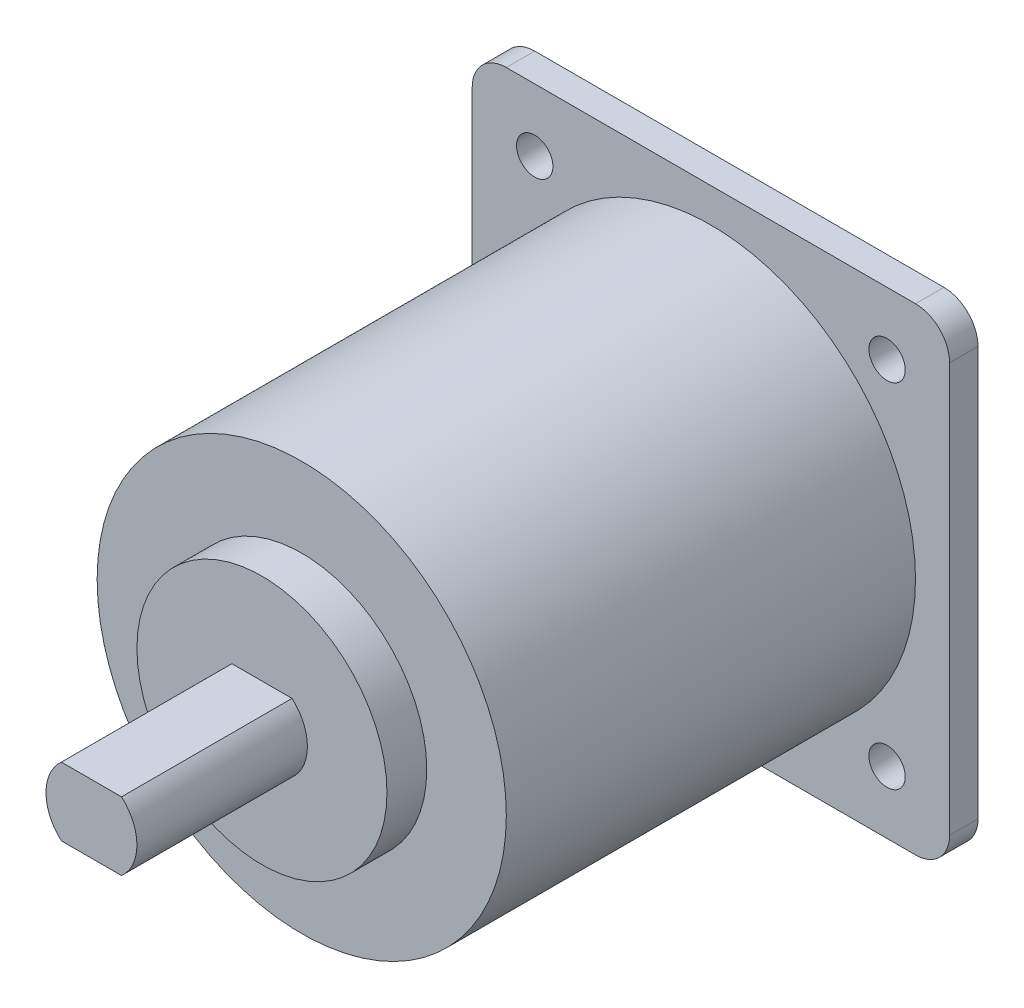
ISO-10303-21;
HEADER;
FILE_DESCRIPTION(('STEP AP214'),'2;1');
FILE_NAME('part.step','',(''),(''),'','','');
FILE_SCHEMA(('AUTOMOTIVE_DESIGN { 1 0 10303 214 1 1 1 1 }'));
ENDSEC;
DATA;
#1=APPLICATION_CONTEXT('core data for automotive mechanical design processes');
#2=APPLICATION_PROTOCOL_DEFINITION('international standard','automotive_design',2000,#1);
#3=PRODUCT_CONTEXT('',#1,'mechanical');
#4=PRODUCT('Part','Part','',(#3));
#5=PRODUCT_RELATED_PRODUCT_CATEGORY('part','',(#4));
#6=PRODUCT_DEFINITION_FORMATION('','',#4);
#7=PRODUCT_DEFINITION_CONTEXT('part definition',#1,'design');
#8=PRODUCT_DEFINITION('design','',#6,#7);
#9=PRODUCT_DEFINITION_SHAPE('','',#8);
#10=(LENGTH_UNIT() NAMED_UNIT(*) SI_UNIT(.MILLI.,.METRE.));
#11=(NAMED_UNIT(*) PLANE_ANGLE_UNIT() SI_UNIT($,.RADIAN.));
#12=(NAMED_UNIT(*) SI_UNIT($,.STERADIAN.) SOLID_ANGLE_UNIT());
#13=UNCERTAINTY_MEASURE_WITH_UNIT(LENGTH_MEASURE(1.E-05),#10,'distance_accuracy_value','');
#14=(GEOMETRIC_REPRESENTATION_CONTEXT(3) GLOBAL_UNCERTAINTY_ASSIGNED_CONTEXT((#13)) GLOBAL_UNIT_ASSIGNED_CONTEXT((#10,
#11,#12)) REPRESENTATION_CONTEXT('',''));
#15=CARTESIAN_POINT('',(0.,0.,0.));
#16=DIRECTION('',(0.,0.,1.));
#17=DIRECTION('',(1.,0.,0.));
#18=AXIS2_PLACEMENT_3D('',#15,#16,#17);
#19=CARTESIAN_POINT('',(0.,0.,38.5));
#20=DIRECTION('',(0.,0.,-1.));
#21=DIRECTION('',(-1.,0.,0.));
#22=AXIS2_PLACEMENT_3D('',#19,#20,#21);
#23=CYLINDRICAL_SURFACE('',#22,18.);
#24=CARTESIAN_POINT('',(0.,0.,38.5));
#25=DIRECTION('',(0.,0.,1.));
#26=DIRECTION('',(1.,0.,0.));
#27=AXIS2_PLACEMENT_3D('',#24,#25,#26);
#28=CIRCLE('',#27,18.);
#29=CARTESIAN_POINT('',(18.,0.,38.5));
#30=VERTEX_POINT('',#29);
#31=EDGE_CURVE('E199',#30,#30,#28,.T.);
#32=ORIENTED_EDGE('',*,*,#31,.F.);
#33=EDGE_LOOP('',(#32));
#34=FACE_BOUND('',#33,.T.);
#35=CARTESIAN_POINT('',(0.,0.,2.5));
#36=DIRECTION('',(0.,0.,-1.));
#37=DIRECTION('',(-1.,0.,0.));
#38=AXIS2_PLACEMENT_3D('',#35,#36,#37);
#39=CIRCLE('',#38,18.);
#40=CARTESIAN_POINT('',(-18.,0.,2.5));
#41=VERTEX_POINT('',#40);
#42=EDGE_CURVE('E212',#41,#41,#39,.T.);
#43=ORIENTED_EDGE('',*,*,#42,.F.);
#44=EDGE_LOOP('',(#43));
#45=FACE_BOUND('',#44,.T.);
#46=ADVANCED_FACE('F43',(#34,#45),#23,.T.);
#47=CARTESIAN_POINT('',(0.,0.,38.5));
#48=DIRECTION('',(0.,0.,1.));
#49=DIRECTION('',(1.,0.,0.));
#50=AXIS2_PLACEMENT_3D('',#47,#48,#49);
#51=PLANE('',#50);
#52=CARTESIAN_POINT('',(0.,0.,38.5));
#53=DIRECTION('',(0.,0.,1.));
#54=DIRECTION('',(1.,0.,0.));
#55=AXIS2_PLACEMENT_3D('',#52,#53,#54);
#56=CIRCLE('',#55,11.);
#57=CARTESIAN_POINT('',(11.,0.,38.5));
#58=VERTEX_POINT('',#57);
#59=EDGE_CURVE('E11',#58,#58,#56,.T.);
#60=ORIENTED_EDGE('',*,*,#59,.F.);
#61=EDGE_LOOP('',(#60));
#62=FACE_BOUND('',#61,.T.);
#63=ORIENTED_EDGE('',*,*,#31,.T.);
#64=EDGE_LOOP('',(#63));
#65=FACE_BOUND('',#64,.T.);
#66=ADVANCED_FACE('F298',(#62,#65),#51,.T.);
#67=CARTESIAN_POINT('',(0.,0.,2.5));
#68=DIRECTION('',(0.,0.,-1.));
#69=DIRECTION('',(-1.,0.,0.));
#70=AXIS2_PLACEMENT_3D('',#67,#68,#69);
#71=PLANE('',#70);
#72=CARTESIAN_POINT('',(15.5,15.5,2.5));
#73=DIRECTION('',(0.,0.,-1.));
#74=DIRECTION('',(-1.,0.,0.));
#75=AXIS2_PLACEMENT_3D('',#72,#73,#74);
#76=CIRCLE('',#75,1.6);
#77=CARTESIAN_POINT('',(13.9,15.5,2.5));
#78=VERTEX_POINT('',#77);
#79=EDGE_CURVE('E172',#78,#78,#76,.T.);
#80=ORIENTED_EDGE('',*,*,#79,.T.);
#81=EDGE_LOOP('',(#80));
#82=FACE_BOUND('',#81,.T.);
#83=CARTESIAN_POINT('',(-15.5,-15.5,2.5));
#84=DIRECTION('',(0.,0.,-1.));
#85=DIRECTION('',(-1.,0.,0.));
#86=AXIS2_PLACEMENT_3D('',#83,#84,#85);
#87=CIRCLE('',#86,1.6);
#88=CARTESIAN_POINT('',(-17.1,-15.5,2.5));
#89=VERTEX_POINT('',#88);
#90=EDGE_CURVE('E165',#89,#89,#87,.T.);
#91=ORIENTED_EDGE('',*,*,#90,.T.);
#92=EDGE_LOOP('',(#91));
#93=FACE_BOUND('',#92,.T.);
#94=CARTESIAN_POINT('',(-15.5,15.5,2.5));
#95=DIRECTION('',(0.,0.,-1.));
#96=DIRECTION('',(-1.,0.,0.));
#97=AXIS2_PLACEMENT_3D('',#94,#95,#96);
#98=CIRCLE('',#97,1.6);
#99=CARTESIAN_POINT('',(-17.1,15.5,2.5));
#100=VERTEX_POINT('',#99);
#101=EDGE_CURVE('E156',#100,#100,#98,.T.);
#102=ORIENTED_EDGE('',*,*,#101,.T.);
#103=EDGE_LOOP('',(#102));
#104=FACE_BOUND('',#103,.T.);
#105=CARTESIAN_POINT('',(15.5,-15.5,2.5));
#106=DIRECTION('',(0.,0.,-1.));
#107=DIRECTION('',(-1.,0.,0.));
#108=AXIS2_PLACEMENT_3D('',#105,#106,#107);
#109=CIRCLE('',#108,1.6);
#110=CARTESIAN_POINT('',(13.9,-15.5,2.5));
#111=VERTEX_POINT('',#110);
#112=EDGE_CURVE('E180',#111,#111,#109,.T.);
#113=ORIENTED_EDGE('',*,*,#112,.T.);
#114=EDGE_LOOP('',(#113));
#115=FACE_BOUND('',#114,.T.);
#116=DIRECTION('',(1.,0.,0.));
#117=VECTOR('',#116,1.);
#118=CARTESIAN_POINT('',(-21.,-21.,2.5));
#119=LINE('',#118,#117);
#120=CARTESIAN_POINT('',(-18.,-21.,2.5));
#121=VERTEX_POINT('',#120);
#122=CARTESIAN_POINT('',(18.,-21.,2.5));
#123=VERTEX_POINT('',#122);
#124=EDGE_CURVE('E196',#121,#123,#119,.T.);
#125=ORIENTED_EDGE('',*,*,#124,.T.);
#126=CARTESIAN_POINT('',(18.,-18.,2.5));
#127=DIRECTION('',(0.,0.,-1.));
#128=DIRECTION('',(-1.,0.,0.));
#129=AXIS2_PLACEMENT_3D('',#126,#127,#128);
#130=CIRCLE('',#129,3.);
#131=CARTESIAN_POINT('',(21.,-18.,2.5));
#132=VERTEX_POINT('',#131);
#133=EDGE_CURVE('E239',#123,#132,#130,.F.);
#134=ORIENTED_EDGE('',*,*,#133,.T.);
#135=DIRECTION('',(0.,1.,0.));
#136=VECTOR('',#135,1.);
#137=CARTESIAN_POINT('',(21.,-21.,2.5));
#138=LINE('',#137,#136);
#139=CARTESIAN_POINT('',(21.,18.,2.5));
#140=VERTEX_POINT('',#139);
#141=EDGE_CURVE('E186',#132,#140,#138,.T.);
#142=ORIENTED_EDGE('',*,*,#141,.T.);
#143=CARTESIAN_POINT('',(18.,18.,2.5));
#144=DIRECTION('',(0.,0.,-1.));
#145=DIRECTION('',(-1.,0.,0.));
#146=AXIS2_PLACEMENT_3D('',#143,#144,#145);
#147=CIRCLE('',#146,3.);
#148=CARTESIAN_POINT('',(18.,21.,2.5));
#149=VERTEX_POINT('',#148);
#150=EDGE_CURVE('E233',#140,#149,#147,.F.);
#151=ORIENTED_EDGE('',*,*,#150,.T.);
#152=DIRECTION('',(-1.,0.,0.));
#153=VECTOR('',#152,1.);
#154=CARTESIAN_POINT('',(-21.,21.,2.5));
#155=LINE('',#154,#153);
#156=CARTESIAN_POINT('',(-18.,21.,2.5));
#157=VERTEX_POINT('',#156);
#158=EDGE_CURVE('E189',#149,#157,#155,.T.);
#159=ORIENTED_EDGE('',*,*,#158,.T.);
#160=CARTESIAN_POINT('',(-18.,18.,2.5));
#161=DIRECTION('',(0.,0.,-1.));
#162=DIRECTION('',(-1.,0.,0.));
#163=AXIS2_PLACEMENT_3D('',#160,#161,#162);
#164=CIRCLE('',#163,3.);
#165=CARTESIAN_POINT('',(-21.,18.,2.5));
#166=VERTEX_POINT('',#165);
#167=EDGE_CURVE('E235',#157,#166,#164,.F.);
#168=ORIENTED_EDGE('',*,*,#167,.T.);
#169=DIRECTION('',(0.,-1.,0.));
#170=VECTOR('',#169,1.);
#171=CARTESIAN_POINT('',(-21.,-21.,2.5));
#172=LINE('',#171,#170);
#173=CARTESIAN_POINT('',(-21.,-18.,2.5));
#174=VERTEX_POINT('',#173);
#175=EDGE_CURVE('E193',#166,#174,#172,.T.);
#176=ORIENTED_EDGE('',*,*,#175,.T.);
#177=CARTESIAN_POINT('',(-18.,-18.,2.5));
#178=DIRECTION('',(0.,0.,-1.));
#179=DIRECTION('',(-1.,0.,0.));
#180=AXIS2_PLACEMENT_3D('',#177,#178,#179);
#181=CIRCLE('',#180,3.);
#182=EDGE_CURVE('E237',#174,#121,#181,.F.);
#183=ORIENTED_EDGE('',*,*,#182,.T.);
#184=EDGE_LOOP('',(#125,#134,#142,#151,#159,#168,#176,#183));
#185=FACE_BOUND('',#184,.T.);
#186=ORIENTED_EDGE('',*,*,#42,.T.);
#187=EDGE_LOOP('',(#186));
#188=FACE_BOUND('',#187,.T.);
#189=ADVANCED_FACE('F256',(#82,#93,#104,#115,#185,#188),#71,.F.);
#190=CARTESIAN_POINT('',(21.,-21.,2.5));
#191=DIRECTION('',(-1.,0.,0.));
#192=DIRECTION('',(0.,0.,1.));
#193=AXIS2_PLACEMENT_3D('',#190,#191,#192);
#194=PLANE('',#193);
#195=ORIENTED_EDGE('',*,*,#141,.F.);
#196=DIRECTION('',(0.,0.,-1.));
#197=VECTOR('',#196,1.);
#198=CARTESIAN_POINT('',(21.,-18.,2.5));
#199=LINE('',#198,#197);
#200=CARTESIAN_POINT('',(21.,-18.,0.));
#201=VERTEX_POINT('',#200);
#202=EDGE_CURVE('E217',#132,#201,#199,.T.);
#203=ORIENTED_EDGE('',*,*,#202,.T.);
#204=DIRECTION('',(0.,1.,0.));
#205=VECTOR('',#204,1.);
#206=CARTESIAN_POINT('',(21.,-21.,0.));
#207=LINE('',#206,#205);
#208=CARTESIAN_POINT('',(21.,18.,0.));
#209=VERTEX_POINT('',#208);
#210=EDGE_CURVE('E183',#201,#209,#207,.T.);
#211=ORIENTED_EDGE('',*,*,#210,.T.);
#212=DIRECTION('',(0.,0.,-1.));
#213=VECTOR('',#212,1.);
#214=CARTESIAN_POINT('',(21.,18.,2.5));
#215=LINE('',#214,#213);
#216=EDGE_CURVE('E215',#209,#140,#215,.F.);
#217=ORIENTED_EDGE('',*,*,#216,.T.);
#218=EDGE_LOOP('',(#195,#203,#211,#217));
#219=FACE_BOUND('',#218,.T.);
#220=ADVANCED_FACE('F284',(#219),#194,.F.);
#221=CARTESIAN_POINT('',(-21.,21.,2.5));
#222=DIRECTION('',(0.,-1.,0.));
#223=DIRECTION('',(0.,0.,-1.));
#224=AXIS2_PLACEMENT_3D('',#221,#222,#223);
#225=PLANE('',#224);
#226=DIRECTION('',(-1.,0.,0.));
#227=VECTOR('',#226,1.);
#228=CARTESIAN_POINT('',(-21.,21.,0.));
#229=LINE('',#228,#227);
#230=CARTESIAN_POINT('',(18.,21.,0.));
#231=VERTEX_POINT('',#230);
#232=CARTESIAN_POINT('',(-18.,21.,0.));
#233=VERTEX_POINT('',#232);
#234=EDGE_CURVE('E202',#231,#233,#229,.T.);
#235=ORIENTED_EDGE('',*,*,#234,.T.);
#236=DIRECTION('',(0.,0.,-1.));
#237=VECTOR('',#236,1.);
#238=CARTESIAN_POINT('',(-18.,21.,2.5));
#239=LINE('',#238,#237);
#240=EDGE_CURVE('E47',#233,#157,#239,.F.);
#241=ORIENTED_EDGE('',*,*,#240,.T.);
#242=ORIENTED_EDGE('',*,*,#158,.F.);
#243=DIRECTION('',(0.,0.,-1.));
#244=VECTOR('',#243,1.);
#245=CARTESIAN_POINT('',(18.,21.,2.5));
#246=LINE('',#245,#244);
#247=EDGE_CURVE('E245',#149,#231,#246,.T.);
#248=ORIENTED_EDGE('',*,*,#247,.T.);
#249=EDGE_LOOP('',(#235,#241,#242,#248));
#250=FACE_BOUND('',#249,.T.);
#251=ADVANCED_FACE('F252',(#250),#225,.F.);
#252=CARTESIAN_POINT('',(-21.,-21.,2.5));
#253=DIRECTION('',(1.,0.,0.));
#254=DIRECTION('',(0.,0.,-1.));
#255=AXIS2_PLACEMENT_3D('',#252,#253,#254);
#256=PLANE('',#255);
#257=DIRECTION('',(0.,-1.,0.));
#258=VECTOR('',#257,1.);
#259=CARTESIAN_POINT('',(-21.,-21.,0.));
#260=LINE('',#259,#258);
#261=CARTESIAN_POINT('',(-21.,18.,0.));
#262=VERTEX_POINT('',#261);
#263=CARTESIAN_POINT('',(-21.,-18.,0.));
#264=VERTEX_POINT('',#263);
#265=EDGE_CURVE('E205',#262,#264,#260,.T.);
#266=ORIENTED_EDGE('',*,*,#265,.T.);
#267=DIRECTION('',(0.,0.,-1.));
#268=VECTOR('',#267,1.);
#269=CARTESIAN_POINT('',(-21.,-18.,2.5));
#270=LINE('',#269,#268);
#271=EDGE_CURVE('E244',#264,#174,#270,.F.);
#272=ORIENTED_EDGE('',*,*,#271,.T.);
#273=ORIENTED_EDGE('',*,*,#175,.F.);
#274=DIRECTION('',(0.,0.,-1.));
#275=VECTOR('',#274,1.);
#276=CARTESIAN_POINT('',(-21.,18.,2.5));
#277=LINE('',#276,#275);
#278=EDGE_CURVE('E241',#166,#262,#277,.T.);
#279=ORIENTED_EDGE('',*,*,#278,.T.);
#280=EDGE_LOOP('',(#266,#272,#273,#279));
#281=FACE_BOUND('',#280,.T.);
#282=ADVANCED_FACE('F264',(#281),#256,.F.);
#283=CARTESIAN_POINT('',(-21.,-21.,2.5));
#284=DIRECTION('',(0.,1.,0.));
#285=DIRECTION('',(0.,0.,1.));
#286=AXIS2_PLACEMENT_3D('',#283,#284,#285);
#287=PLANE('',#286);
#288=DIRECTION('',(1.,0.,0.));
#289=VECTOR('',#288,1.);
#290=CARTESIAN_POINT('',(-21.,-21.,0.));
#291=LINE('',#290,#289);
#292=CARTESIAN_POINT('',(-18.,-21.,0.));
#293=VERTEX_POINT('',#292);
#294=CARTESIAN_POINT('',(18.,-21.,0.));
#295=VERTEX_POINT('',#294);
#296=EDGE_CURVE('E190',#293,#295,#291,.T.);
#297=ORIENTED_EDGE('',*,*,#296,.T.);
#298=DIRECTION('',(0.,0.,-1.));
#299=VECTOR('',#298,1.);
#300=CARTESIAN_POINT('',(18.,-21.,2.5));
#301=LINE('',#300,#299);
#302=EDGE_CURVE('E231',#295,#123,#301,.F.);
#303=ORIENTED_EDGE('',*,*,#302,.T.);
#304=ORIENTED_EDGE('',*,*,#124,.F.);
#305=DIRECTION('',(0.,0.,-1.));
#306=VECTOR('',#305,1.);
#307=CARTESIAN_POINT('',(-18.,-21.,2.5));
#308=LINE('',#307,#306);
#309=EDGE_CURVE('E228',#121,#293,#308,.T.);
#310=ORIENTED_EDGE('',*,*,#309,.T.);
#311=EDGE_LOOP('',(#297,#303,#304,#310));
#312=FACE_BOUND('',#311,.T.);
#313=ADVANCED_FACE('F276',(#312),#287,.F.);
#314=CARTESIAN_POINT('',(0.,0.,0.));
#315=DIRECTION('',(0.,0.,1.));
#316=DIRECTION('',(1.,0.,0.));
#317=AXIS2_PLACEMENT_3D('',#314,#315,#316);
#318=PLANE('',#317);
#319=CARTESIAN_POINT('',(0.,0.,0.));
#320=DIRECTION('',(0.,0.,-1.));
#321=DIRECTION('',(-1.,0.,0.));
#322=AXIS2_PLACEMENT_3D('',#319,#320,#321);
#323=CIRCLE('',#322,11.);
#324=CARTESIAN_POINT('',(-11.,0.,0.));
#325=VERTEX_POINT('',#324);
#326=EDGE_CURVE('E518',#325,#325,#323,.T.);
#327=ORIENTED_EDGE('',*,*,#326,.F.);
#328=EDGE_LOOP('',(#327));
#329=FACE_BOUND('',#328,.T.);
#330=CARTESIAN_POINT('',(15.5,15.5,0.));
#331=DIRECTION('',(0.,0.,-1.));
#332=DIRECTION('',(-1.,0.,0.));
#333=AXIS2_PLACEMENT_3D('',#330,#331,#332);
#334=CIRCLE('',#333,1.6);
#335=CARTESIAN_POINT('',(13.9,15.5,0.));
#336=VERTEX_POINT('',#335);
#337=EDGE_CURVE('E168',#336,#336,#334,.T.);
#338=ORIENTED_EDGE('',*,*,#337,.F.);
#339=EDGE_LOOP('',(#338));
#340=FACE_BOUND('',#339,.T.);
#341=CARTESIAN_POINT('',(-15.5,-15.5,0.));
#342=DIRECTION('',(0.,0.,-1.));
#343=DIRECTION('',(-1.,0.,0.));
#344=AXIS2_PLACEMENT_3D('',#341,#342,#343);
#345=CIRCLE('',#344,1.6);
#346=CARTESIAN_POINT('',(-17.1,-15.5,0.));
#347=VERTEX_POINT('',#346);
#348=EDGE_CURVE('E175',#347,#347,#345,.T.);
#349=ORIENTED_EDGE('',*,*,#348,.F.);
#350=EDGE_LOOP('',(#349));
#351=FACE_BOUND('',#350,.T.);
#352=CARTESIAN_POINT('',(-15.5,15.5,0.));
#353=DIRECTION('',(0.,0.,-1.));
#354=DIRECTION('',(-1.,0.,0.));
#355=AXIS2_PLACEMENT_3D('',#352,#353,#354);
#356=CIRCLE('',#355,1.6);
#357=CARTESIAN_POINT('',(-17.1,15.5,0.));
#358=VERTEX_POINT('',#357);
#359=EDGE_CURVE('E162',#358,#358,#356,.T.);
#360=ORIENTED_EDGE('',*,*,#359,.F.);
#361=EDGE_LOOP('',(#360));
#362=FACE_BOUND('',#361,.T.);
#363=CARTESIAN_POINT('',(15.5,-15.5,0.));
#364=DIRECTION('',(0.,0.,-1.));
#365=DIRECTION('',(-1.,0.,0.));
#366=AXIS2_PLACEMENT_3D('',#363,#364,#365);
#367=CIRCLE('',#366,1.6);
#368=CARTESIAN_POINT('',(13.9,-15.5,0.));
#369=VERTEX_POINT('',#368);
#370=EDGE_CURVE('E171',#369,#369,#367,.T.);
#371=ORIENTED_EDGE('',*,*,#370,.F.);
#372=EDGE_LOOP('',(#371));
#373=FACE_BOUND('',#372,.T.);
#374=ORIENTED_EDGE('',*,*,#210,.F.);
#375=CARTESIAN_POINT('',(18.,-18.,0.));
#376=DIRECTION('',(0.,0.,1.));
#377=DIRECTION('',(1.,0.,0.));
#378=AXIS2_PLACEMENT_3D('',#375,#376,#377);
#379=CIRCLE('',#378,3.);
#380=EDGE_CURVE('E226',#201,#295,#379,.F.);
#381=ORIENTED_EDGE('',*,*,#380,.T.);
#382=ORIENTED_EDGE('',*,*,#296,.F.);
#383=CARTESIAN_POINT('',(-18.,-18.,0.));
#384=DIRECTION('',(0.,0.,1.));
#385=DIRECTION('',(1.,0.,0.));
#386=AXIS2_PLACEMENT_3D('',#383,#384,#385);
#387=CIRCLE('',#386,3.);
#388=EDGE_CURVE('E224',#293,#264,#387,.F.);
#389=ORIENTED_EDGE('',*,*,#388,.T.);
#390=ORIENTED_EDGE('',*,*,#265,.F.);
#391=CARTESIAN_POINT('',(-18.,18.,0.));
#392=DIRECTION('',(0.,0.,1.));
#393=DIRECTION('',(1.,0.,0.));
#394=AXIS2_PLACEMENT_3D('',#391,#392,#393);
#395=CIRCLE('',#394,3.);
#396=EDGE_CURVE('E222',#262,#233,#395,.F.);
#397=ORIENTED_EDGE('',*,*,#396,.T.);
#398=ORIENTED_EDGE('',*,*,#234,.F.);
#399=CARTESIAN_POINT('',(18.,18.,0.));
#400=DIRECTION('',(0.,0.,1.));
#401=DIRECTION('',(1.,0.,0.));
#402=AXIS2_PLACEMENT_3D('',#399,#400,#401);
#403=CIRCLE('',#402,3.);
#404=EDGE_CURVE('E220',#231,#209,#403,.F.);
#405=ORIENTED_EDGE('',*,*,#404,.T.);
#406=EDGE_LOOP('',(#374,#381,#382,#389,#390,#397,#398,#405));
#407=FACE_BOUND('',#406,.T.);
#408=ADVANCED_FACE('F268',(#329,#340,#351,#362,#373,#407),#318,.F.);
#409=CARTESIAN_POINT('',(18.,-18.,2.5));
#410=DIRECTION('',(0.,0.,-1.));
#411=DIRECTION('',(-1.,0.,0.));
#412=AXIS2_PLACEMENT_3D('',#409,#410,#411);
#413=CYLINDRICAL_SURFACE('',#412,3.);
#414=ORIENTED_EDGE('',*,*,#133,.F.);
#415=ORIENTED_EDGE('',*,*,#302,.F.);
#416=ORIENTED_EDGE('',*,*,#380,.F.);
#417=ORIENTED_EDGE('',*,*,#202,.F.);
#418=EDGE_LOOP('',(#414,#415,#416,#417));
#419=FACE_BOUND('',#418,.T.);
#420=ADVANCED_FACE('F282',(#419),#413,.T.);
#421=CARTESIAN_POINT('',(-18.,-18.,2.5));
#422=DIRECTION('',(0.,0.,-1.));
#423=DIRECTION('',(-1.,0.,0.));
#424=AXIS2_PLACEMENT_3D('',#421,#422,#423);
#425=CYLINDRICAL_SURFACE('',#424,3.);
#426=ORIENTED_EDGE('',*,*,#182,.F.);
#427=ORIENTED_EDGE('',*,*,#271,.F.);
#428=ORIENTED_EDGE('',*,*,#388,.F.);
#429=ORIENTED_EDGE('',*,*,#309,.F.);
#430=EDGE_LOOP('',(#426,#427,#428,#429));
#431=FACE_BOUND('',#430,.T.);
#432=ADVANCED_FACE('F273',(#431),#425,.T.);
#433=CARTESIAN_POINT('',(-18.,18.,2.5));
#434=DIRECTION('',(0.,0.,-1.));
#435=DIRECTION('',(-1.,0.,0.));
#436=AXIS2_PLACEMENT_3D('',#433,#434,#435);
#437=CYLINDRICAL_SURFACE('',#436,3.);
#438=ORIENTED_EDGE('',*,*,#167,.F.);
#439=ORIENTED_EDGE('',*,*,#240,.F.);
#440=ORIENTED_EDGE('',*,*,#396,.F.);
#441=ORIENTED_EDGE('',*,*,#278,.F.);
#442=EDGE_LOOP('',(#438,#439,#440,#441));
#443=FACE_BOUND('',#442,.T.);
#444=ADVANCED_FACE('F261',(#443),#437,.T.);
#445=CARTESIAN_POINT('',(18.,18.,2.5));
#446=DIRECTION('',(0.,0.,-1.));
#447=DIRECTION('',(-1.,0.,0.));
#448=AXIS2_PLACEMENT_3D('',#445,#446,#447);
#449=CYLINDRICAL_SURFACE('',#448,3.);
#450=ORIENTED_EDGE('',*,*,#150,.F.);
#451=ORIENTED_EDGE('',*,*,#216,.F.);
#452=ORIENTED_EDGE('',*,*,#404,.F.);
#453=ORIENTED_EDGE('',*,*,#247,.F.);
#454=EDGE_LOOP('',(#450,#451,#452,#453));
#455=FACE_BOUND('',#454,.T.);
#456=ADVANCED_FACE('F45',(#455),#449,.T.);
#457=CARTESIAN_POINT('',(15.5,-15.5,2.5));
#458=DIRECTION('',(0.,0.,-1.));
#459=DIRECTION('',(-1.,0.,0.));
#460=AXIS2_PLACEMENT_3D('',#457,#458,#459);
#461=CYLINDRICAL_SURFACE('',#460,1.6);
#462=ORIENTED_EDGE('',*,*,#112,.F.);
#463=EDGE_LOOP('',(#462));
#464=FACE_BOUND('',#463,.T.);
#465=ORIENTED_EDGE('',*,*,#370,.T.);
#466=EDGE_LOOP('',(#465));
#467=FACE_BOUND('',#466,.T.);
#468=ADVANCED_FACE('F288',(#464,#467),#461,.F.);
#469=CARTESIAN_POINT('',(-15.5,15.5,2.5));
#470=DIRECTION('',(0.,0.,-1.));
#471=DIRECTION('',(-1.,0.,0.));
#472=AXIS2_PLACEMENT_3D('',#469,#470,#471);
#473=CYLINDRICAL_SURFACE('',#472,1.6);
#474=ORIENTED_EDGE('',*,*,#101,.F.);
#475=EDGE_LOOP('',(#474));
#476=FACE_BOUND('',#475,.T.);
#477=ORIENTED_EDGE('',*,*,#359,.T.);
#478=EDGE_LOOP('',(#477));
#479=FACE_BOUND('',#478,.T.);
#480=ADVANCED_FACE('F294',(#476,#479),#473,.F.);
#481=CARTESIAN_POINT('',(-15.5,-15.5,2.5));
#482=DIRECTION('',(0.,0.,-1.));
#483=DIRECTION('',(-1.,0.,0.));
#484=AXIS2_PLACEMENT_3D('',#481,#482,#483);
#485=CYLINDRICAL_SURFACE('',#484,1.6);
#486=ORIENTED_EDGE('',*,*,#90,.F.);
#487=EDGE_LOOP('',(#486));
#488=FACE_BOUND('',#487,.T.);
#489=ORIENTED_EDGE('',*,*,#348,.T.);
#490=EDGE_LOOP('',(#489));
#491=FACE_BOUND('',#490,.T.);
#492=ADVANCED_FACE('F344',(#488,#491),#485,.F.);
#493=CARTESIAN_POINT('',(15.5,15.5,2.5));
#494=DIRECTION('',(0.,0.,-1.));
#495=DIRECTION('',(-1.,0.,0.));
#496=AXIS2_PLACEMENT_3D('',#493,#494,#495);
#497=CYLINDRICAL_SURFACE('',#496,1.6);
#498=ORIENTED_EDGE('',*,*,#79,.F.);
#499=EDGE_LOOP('',(#498));
#500=FACE_BOUND('',#499,.T.);
#501=ORIENTED_EDGE('',*,*,#337,.T.);
#502=EDGE_LOOP('',(#501));
#503=FACE_BOUND('',#502,.T.);
#504=ADVANCED_FACE('F354',(#500,#503),#497,.F.);
#505=CARTESIAN_POINT('',(0.,0.,42.));
#506=DIRECTION('',(0.,0.,-1.));
#507=DIRECTION('',(-1.,0.,0.));
#508=AXIS2_PLACEMENT_3D('',#505,#506,#507);
#509=CYLINDRICAL_SURFACE('',#508,11.);
#510=CARTESIAN_POINT('',(0.,0.,42.));
#511=DIRECTION('',(0.,0.,1.));
#512=DIRECTION('',(1.,0.,0.));
#513=AXIS2_PLACEMENT_3D('',#510,#511,#512);
#514=CIRCLE('',#513,11.);
#515=CARTESIAN_POINT('',(11.,0.,42.));
#516=VERTEX_POINT('',#515);
#517=EDGE_CURVE('E153',#516,#516,#514,.T.);
#518=ORIENTED_EDGE('',*,*,#517,.F.);
#519=EDGE_LOOP('',(#518));
#520=FACE_BOUND('',#519,.T.);
#521=ORIENTED_EDGE('',*,*,#59,.T.);
#522=EDGE_LOOP('',(#521));
#523=FACE_BOUND('',#522,.T.);
#524=ADVANCED_FACE('F364',(#520,#523),#509,.T.);
#525=CARTESIAN_POINT('',(0.,0.,42.));
#526=DIRECTION('',(0.,0.,1.));
#527=DIRECTION('',(1.,0.,0.));
#528=AXIS2_PLACEMENT_3D('',#525,#526,#527);
#529=PLANE('',#528);
#530=CARTESIAN_POINT('',(0.,0.,42.));
#531=DIRECTION('',(0.,0.,1.));
#532=DIRECTION('',(1.,0.,0.));
#533=AXIS2_PLACEMENT_3D('',#530,#531,#532);
#534=CIRCLE('',#533,4.);
#535=CARTESIAN_POINT('',(-2.64575131106459,3.,42.));
#536=VERTEX_POINT('',#535);
#537=CARTESIAN_POINT('',(-2.64575131106459,-3.,42.));
#538=VERTEX_POINT('',#537);
#539=EDGE_CURVE('E59',#536,#538,#534,.T.);
#540=ORIENTED_EDGE('',*,*,#539,.F.);
#541=DIRECTION('',(-1.,0.,0.));
#542=VECTOR('',#541,1.);
#543=CARTESIAN_POINT('',(-2.64575131106459,3.,42.));
#544=LINE('',#543,#542);
#545=CARTESIAN_POINT('',(2.64575131106459,3.,42.));
#546=VERTEX_POINT('',#545);
#547=EDGE_CURVE('E63',#546,#536,#544,.T.);
#548=ORIENTED_EDGE('',*,*,#547,.F.);
#549=CARTESIAN_POINT('',(0.,0.,42.));
#550=DIRECTION('',(0.,0.,1.));
#551=DIRECTION('',(-1.,0.,0.));
#552=AXIS2_PLACEMENT_3D('',#549,#550,#551);
#553=CIRCLE('',#552,4.);
#554=CARTESIAN_POINT('',(2.64575131106459,-3.,42.));
#555=VERTEX_POINT('',#554);
#556=EDGE_CURVE('E541',#555,#546,#553,.T.);
#557=ORIENTED_EDGE('',*,*,#556,.F.);
#558=DIRECTION('',(1.,0.,0.));
#559=VECTOR('',#558,1.);
#560=CARTESIAN_POINT('',(-2.64575131106459,-3.,42.));
#561=LINE('',#560,#559);
#562=EDGE_CURVE('E539',#538,#555,#561,.T.);
#563=ORIENTED_EDGE('',*,*,#562,.F.);
#564=EDGE_LOOP('',(#540,#548,#557,#563));
#565=FACE_BOUND('',#564,.T.);
#566=ORIENTED_EDGE('',*,*,#517,.T.);
#567=EDGE_LOOP('',(#566));
#568=FACE_BOUND('',#567,.T.);
#569=ADVANCED_FACE('F374',(#565,#568),#529,.T.);
#570=CARTESIAN_POINT('',(0.,0.,57.));
#571=DIRECTION('',(0.,0.,-1.));
#572=DIRECTION('',(-1.,0.,0.));
#573=AXIS2_PLACEMENT_3D('',#570,#571,#572);
#574=CYLINDRICAL_SURFACE('',#573,4.);
#575=ORIENTED_EDGE('',*,*,#539,.T.);
#576=DIRECTION('',(0.,0.,-1.));
#577=VECTOR('',#576,1.);
#578=CARTESIAN_POINT('',(-2.64575131106459,-3.,57.));
#579=LINE('',#578,#577);
#580=CARTESIAN_POINT('',(-2.64575131106459,-3.,57.));
#581=VERTEX_POINT('',#580);
#582=EDGE_CURVE('E136',#581,#538,#579,.T.);
#583=ORIENTED_EDGE('',*,*,#582,.F.);
#584=CARTESIAN_POINT('',(0.,0.,57.));
#585=DIRECTION('',(0.,0.,1.));
#586=DIRECTION('',(1.,0.,0.));
#587=AXIS2_PLACEMENT_3D('',#584,#585,#586);
#588=CIRCLE('',#587,4.);
#589=CARTESIAN_POINT('',(-2.64575131106459,3.,57.));
#590=VERTEX_POINT('',#589);
#591=EDGE_CURVE('E142',#590,#581,#588,.T.);
#592=ORIENTED_EDGE('',*,*,#591,.F.);
#593=DIRECTION('',(0.,0.,-1.));
#594=VECTOR('',#593,1.);
#595=CARTESIAN_POINT('',(-2.64575131106459,3.,57.));
#596=LINE('',#595,#594);
#597=EDGE_CURVE('E537',#590,#536,#596,.T.);
#598=ORIENTED_EDGE('',*,*,#597,.T.);
#599=EDGE_LOOP('',(#575,#583,#592,#598));
#600=FACE_BOUND('',#599,.T.);
#601=ADVANCED_FACE('F152',(#600),#574,.T.);
#602=CARTESIAN_POINT('',(-2.64575131106459,-3.,57.));
#603=DIRECTION('',(0.,1.,0.));
#604=DIRECTION('',(-1.,0.,0.));
#605=AXIS2_PLACEMENT_3D('',#602,#603,#604);
#606=PLANE('',#605);
#607=ORIENTED_EDGE('',*,*,#562,.T.);
#608=DIRECTION('',(0.,0.,-1.));
#609=VECTOR('',#608,1.);
#610=CARTESIAN_POINT('',(2.64575131106459,-3.,57.));
#611=LINE('',#610,#609);
#612=CARTESIAN_POINT('',(2.64575131106459,-3.,57.));
#613=VERTEX_POINT('',#612);
#614=EDGE_CURVE('E138',#613,#555,#611,.T.);
#615=ORIENTED_EDGE('',*,*,#614,.F.);
#616=DIRECTION('',(1.,0.,0.));
#617=VECTOR('',#616,1.);
#618=CARTESIAN_POINT('',(-2.64575131106459,-3.,57.));
#619=LINE('',#618,#617);
#620=EDGE_CURVE('E131',#581,#613,#619,.T.);
#621=ORIENTED_EDGE('',*,*,#620,.F.);
#622=ORIENTED_EDGE('',*,*,#582,.T.);
#623=EDGE_LOOP('',(#607,#615,#621,#622));
#624=FACE_BOUND('',#623,.T.);
#625=ADVANCED_FACE('F134',(#624),#606,.F.);
#626=CARTESIAN_POINT('',(0.,0.,57.));
#627=DIRECTION('',(0.,0.,-1.));
#628=DIRECTION('',(-1.,0.,0.));
#629=AXIS2_PLACEMENT_3D('',#626,#627,#628);
#630=CYLINDRICAL_SURFACE('',#629,4.);
#631=ORIENTED_EDGE('',*,*,#556,.T.);
#632=DIRECTION('',(0.,0.,-1.));
#633=VECTOR('',#632,1.);
#634=CARTESIAN_POINT('',(2.64575131106459,3.,57.));
#635=LINE('',#634,#633);
#636=CARTESIAN_POINT('',(2.64575131106459,3.,57.));
#637=VERTEX_POINT('',#636);
#638=EDGE_CURVE('E158',#637,#546,#635,.T.);
#639=ORIENTED_EDGE('',*,*,#638,.F.);
#640=CARTESIAN_POINT('',(0.,0.,57.));
#641=DIRECTION('',(0.,0.,1.));
#642=DIRECTION('',(-1.,0.,0.));
#643=AXIS2_PLACEMENT_3D('',#640,#641,#642);
#644=CIRCLE('',#643,4.);
#645=EDGE_CURVE('E141',#613,#637,#644,.T.);
#646=ORIENTED_EDGE('',*,*,#645,.F.);
#647=ORIENTED_EDGE('',*,*,#614,.T.);
#648=EDGE_LOOP('',(#631,#639,#646,#647));
#649=FACE_BOUND('',#648,.T.);
#650=ADVANCED_FACE('F400',(#649),#630,.T.);
#651=CARTESIAN_POINT('',(-2.64575131106459,3.,57.));
#652=DIRECTION('',(0.,-1.,0.));
#653=DIRECTION('',(0.,0.,-1.));
#654=AXIS2_PLACEMENT_3D('',#651,#652,#653);
#655=PLANE('',#654);
#656=ORIENTED_EDGE('',*,*,#547,.T.);
#657=ORIENTED_EDGE('',*,*,#597,.F.);
#658=DIRECTION('',(-1.,0.,0.));
#659=VECTOR('',#658,1.);
#660=CARTESIAN_POINT('',(-2.64575131106459,3.,57.));
#661=LINE('',#660,#659);
#662=EDGE_CURVE('E147',#637,#590,#661,.T.);
#663=ORIENTED_EDGE('',*,*,#662,.F.);
#664=ORIENTED_EDGE('',*,*,#638,.T.);
#665=EDGE_LOOP('',(#656,#657,#663,#664));
#666=FACE_BOUND('',#665,.T.);
#667=ADVANCED_FACE('F409',(#666),#655,.F.);
#668=CARTESIAN_POINT('',(0.,0.,57.));
#669=DIRECTION('',(0.,0.,1.));
#670=DIRECTION('',(1.,0.,0.));
#671=AXIS2_PLACEMENT_3D('',#668,#669,#670);
#672=PLANE('',#671);
#673=ORIENTED_EDGE('',*,*,#591,.T.);
#674=ORIENTED_EDGE('',*,*,#620,.T.);
#675=ORIENTED_EDGE('',*,*,#645,.T.);
#676=ORIENTED_EDGE('',*,*,#662,.T.);
#677=EDGE_LOOP('',(#673,#674,#675,#676));
#678=FACE_BOUND('',#677,.T.);
#679=ADVANCED_FACE('F145',(#678),#672,.T.);
#680=CARTESIAN_POINT('',(0.,0.,25.));
#681=DIRECTION('',(0.,0.,-1.));
#682=DIRECTION('',(-1.,0.,0.));
#683=AXIS2_PLACEMENT_3D('',#680,#681,#682);
#684=CYLINDRICAL_SURFACE('',#683,11.);
#685=CARTESIAN_POINT('',(0.,0.,25.));
#686=DIRECTION('',(0.,0.,-1.));
#687=DIRECTION('',(-1.,0.,0.));
#688=AXIS2_PLACEMENT_3D('',#685,#686,#687);
#689=CIRCLE('',#688,11.);
#690=CARTESIAN_POINT('',(-11.,0.,25.));
#691=VERTEX_POINT('',#690);
#692=EDGE_CURVE('E531',#691,#691,#689,.T.);
#693=ORIENTED_EDGE('',*,*,#692,.F.);
#694=EDGE_LOOP('',(#693));
#695=FACE_BOUND('',#694,.T.);
#696=ORIENTED_EDGE('',*,*,#326,.T.);
#697=EDGE_LOOP('',(#696));
#698=FACE_BOUND('',#697,.T.);
#699=ADVANCED_FACE('F428',(#695,#698),#684,.F.);
#700=CARTESIAN_POINT('',(0.,0.,25.));
#701=DIRECTION('',(0.,0.,-1.));
#702=DIRECTION('',(-1.,0.,0.));
#703=AXIS2_PLACEMENT_3D('',#700,#701,#702);
#704=PLANE('',#703);
#705=ORIENTED_EDGE('',*,*,#692,.T.);
#706=EDGE_LOOP('',(#705));
#707=FACE_BOUND('',#706,.T.);
#708=ADVANCED_FACE('F438',(#707),#704,.T.);
#709=CLOSED_SHELL('',(#46,#66,#189,#220,#251,#282,#313,#408,#420,#432,#444,#456,#468,#480,#492,
#504,#524,#569,#601,#625,#650,#667,#679,#699,#708));
#710=MANIFOLD_SOLID_BREP('B2',#709);
#711=ADVANCED_BREP_SHAPE_REPRESENTATION('',(#18,#710),#14);
#712=SHAPE_DEFINITION_REPRESENTATION(#9,#711);
ENDSEC;
END-ISO-10303-21;
